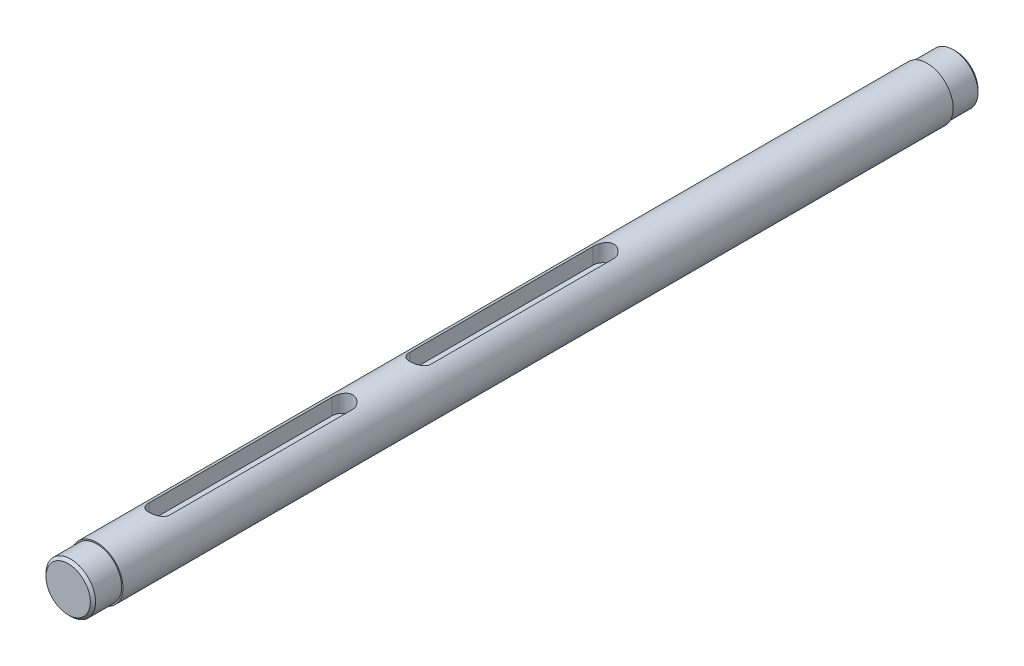
ISO-10303-21;
HEADER;
FILE_DESCRIPTION(('STEP AP214'),'2;1');
FILE_NAME('part.step','',(''),(''),'','','');
FILE_SCHEMA(('AUTOMOTIVE_DESIGN { 1 0 10303 214 1 1 1 1 }'));
ENDSEC;
DATA;
#1=APPLICATION_CONTEXT('core data for automotive mechanical design processes');
#2=APPLICATION_PROTOCOL_DEFINITION('international standard','automotive_design',2000,#1);
#3=PRODUCT_CONTEXT('',#1,'mechanical');
#4=PRODUCT('Part','Part','',(#3));
#5=PRODUCT_RELATED_PRODUCT_CATEGORY('part','',(#4));
#6=PRODUCT_DEFINITION_FORMATION('','',#4);
#7=PRODUCT_DEFINITION_CONTEXT('part definition',#1,'design');
#8=PRODUCT_DEFINITION('design','',#6,#7);
#9=PRODUCT_DEFINITION_SHAPE('','',#8);
#10=(LENGTH_UNIT() NAMED_UNIT(*) SI_UNIT(.MILLI.,.METRE.));
#11=(NAMED_UNIT(*) PLANE_ANGLE_UNIT() SI_UNIT($,.RADIAN.));
#12=(NAMED_UNIT(*) SI_UNIT($,.STERADIAN.) SOLID_ANGLE_UNIT());
#13=UNCERTAINTY_MEASURE_WITH_UNIT(LENGTH_MEASURE(1.E-05),#10,'distance_accuracy_value','');
#14=(GEOMETRIC_REPRESENTATION_CONTEXT(3) GLOBAL_UNCERTAINTY_ASSIGNED_CONTEXT((#13)) GLOBAL_UNIT_ASSIGNED_CONTEXT((#10,
#11,#12)) REPRESENTATION_CONTEXT('',''));
#15=CARTESIAN_POINT('',(0.,0.,0.));
#16=DIRECTION('',(0.,0.,1.));
#17=DIRECTION('',(1.,0.,0.));
#18=AXIS2_PLACEMENT_3D('',#15,#16,#17);
#19=CARTESIAN_POINT('',(0.,0.,170.));
#20=DIRECTION('',(0.,0.,-1.));
#21=DIRECTION('',(-1.,0.,0.));
#22=AXIS2_PLACEMENT_3D('',#19,#20,#21);
#23=CYLINDRICAL_SURFACE('',#22,5.);
#24=CARTESIAN_POINT('',(0.,0.,164.5));
#25=DIRECTION('',(0.,0.,1.));
#26=DIRECTION('',(1.,0.,0.));
#27=AXIS2_PLACEMENT_3D('',#24,#25,#26);
#28=CIRCLE('',#27,5.);
#29=CARTESIAN_POINT('',(5.,0.,164.5));
#30=VERTEX_POINT('',#29);
#31=EDGE_CURVE('E151',#30,#30,#28,.T.);
#32=ORIENTED_EDGE('',*,*,#31,.F.);
#33=EDGE_LOOP('',(#32));
#34=FACE_BOUND('',#33,.T.);
#35=CARTESIAN_POINT('',(0.,0.,5.5));
#36=DIRECTION('',(0.,0.,-1.));
#37=DIRECTION('',(-1.,0.,0.));
#38=AXIS2_PLACEMENT_3D('',#35,#36,#37);
#39=CIRCLE('',#38,5.);
#40=CARTESIAN_POINT('',(-5.,0.,5.5));
#41=VERTEX_POINT('',#40);
#42=EDGE_CURVE('E145',#41,#41,#39,.T.);
#43=ORIENTED_EDGE('',*,*,#42,.F.);
#44=EDGE_LOOP('',(#43));
#45=FACE_BOUND('',#44,.T.);
#46=CARTESIAN_POINT('',(0.,5.,119.5));
#47=CARTESIAN_POINT('',(0.107493005442879,4.99999271227085,119.499990148176));
#48=CARTESIAN_POINT('',(0.215172564090662,4.99649294306933,119.491282247912));
#49=CARTESIAN_POINT('',(0.427496480417884,4.98283453100642,119.456752296479));
#50=CARTESIAN_POINT('',(0.532131777561236,4.97265778698877,119.430883720914));
#51=CARTESIAN_POINT('',(0.734953922727389,4.94674209213119,119.363123921941));
#52=CARTESIAN_POINT('',(0.833160661616945,4.93102136364072,119.321285153783));
#53=CARTESIAN_POINT('',(1.02107197032835,4.89556610796078,119.222980826673));
#54=CARTESIAN_POINT('',(1.11077947675098,4.87583297458057,119.166520345081));
#55=CARTESIAN_POINT('',(1.28350100757038,4.83330886170419,119.037764501439));
#56=CARTESIAN_POINT('',(1.3660622725502,4.81042296929191,118.96489334376));
#57=CARTESIAN_POINT('',(1.51817500478471,4.76460576906195,118.806599996523));
#58=CARTESIAN_POINT('',(1.58772010713352,4.74167444453793,118.721171702788));
#59=CARTESIAN_POINT('',(1.71487456729287,4.69722791797137,118.535571929758));
#60=CARTESIAN_POINT('',(1.77181498119547,4.67582115964952,118.434913513977));
#61=CARTESIAN_POINT('',(1.86775471903714,4.63833647186793,118.22446360158));
#62=CARTESIAN_POINT('',(1.90676256428583,4.62225601244176,118.114676472152));
#63=CARTESIAN_POINT('',(1.96389882339586,4.59826357660819,117.894287666408));
#64=CARTESIAN_POINT('',(1.98289396580564,4.59001420355605,117.783948764424));
#65=CARTESIAN_POINT('',(2.00217296164002,4.58164004049144,117.561365001693));
#66=CARTESIAN_POINT('',(2.00246601631321,4.58151125522769,117.449121105375));
#67=CARTESIAN_POINT('',(1.98498936750453,4.58910500279995,117.234243328542));
#68=CARTESIAN_POINT('',(1.96847531430512,4.59628175038451,117.131484285591));
#69=CARTESIAN_POINT('',(1.91994688029781,4.61676187607837,116.930340443993));
#70=CARTESIAN_POINT('',(1.88792979480462,4.63006632321673,116.83195641189));
#71=CARTESIAN_POINT('',(1.80869473255106,4.66159485088531,116.639982163804));
#72=CARTESIAN_POINT('',(1.76117986231531,4.67991379280788,116.546530760945));
#73=CARTESIAN_POINT('',(1.65250646073221,4.7193811638989,116.368584183638));
#74=CARTESIAN_POINT('',(1.59134280510084,4.74053065456849,116.284092390597));
#75=CARTESIAN_POINT('',(1.45155059945443,4.78526736742271,116.119590271198));
#76=CARTESIAN_POINT('',(1.37193746297063,4.80891664976152,116.040431270554));
#77=CARTESIAN_POINT('',(1.20031442743018,4.85459824958282,115.896315521998));
#78=CARTESIAN_POINT('',(1.10830206533442,4.87663024445325,115.83136160259));
#79=CARTESIAN_POINT('',(0.912077652605827,4.91714681264549,115.716382552584));
#80=CARTESIAN_POINT('',(0.807660491346464,4.93555270095415,115.666677718803));
#81=CARTESIAN_POINT('',(0.591023765482872,4.96614828328759,115.585832138922));
#82=CARTESIAN_POINT('',(0.478808196849664,4.97834113462382,115.554681962443));
#83=CARTESIAN_POINT('',(0.256895887607812,4.99456139506911,115.51355170458));
#84=CARTESIAN_POINT('',(0.147443293985527,4.99902945833514,115.502427545746));
#85=CARTESIAN_POINT('',(-0.0718453098078256,5.00068478510631,115.498286899471));
#86=CARTESIAN_POINT('',(-0.181681213223933,4.99787393582292,115.505265718453));
#87=CARTESIAN_POINT('',(-0.393432739121997,4.98557567063753,115.536291752552));
#88=CARTESIAN_POINT('',(-0.495482491775483,4.97639391345523,115.559557980351));
#89=CARTESIAN_POINT('',(-0.69413542806079,4.952594414055,115.62143570831));
#90=CARTESIAN_POINT('',(-0.790737910224855,4.9379759735653,115.660049179669));
#91=CARTESIAN_POINT('',(-0.979078785816716,4.90416594770811,115.75278493968));
#92=CARTESIAN_POINT('',(-1.07057802275542,4.88484815979803,115.807345472043));
#93=CARTESIAN_POINT('',(-1.24344359124657,4.84373364745524,115.929940323906));
#94=CARTESIAN_POINT('',(-1.32480584076114,4.8219359311027,115.997980042923));
#95=CARTESIAN_POINT('',(-1.48072304302883,4.77645117638111,116.15087001295));
#96=CARTESIAN_POINT('',(-1.55447393380608,4.75273441425051,116.236533541506));
#97=CARTESIAN_POINT('',(-1.68675119741372,4.70741672917132,116.419440083009));
#98=CARTESIAN_POINT('',(-1.74527506133752,4.6858161552651,116.51668500034));
#99=CARTESIAN_POINT('',(-1.84580750193164,4.64714299907708,116.721461694594));
#100=CARTESIAN_POINT('',(-1.88765059453446,4.63011630884787,116.829083999212));
#101=CARTESIAN_POINT('',(-1.95229621970532,4.60323673477931,117.050733651715));
#102=CARTESIAN_POINT('',(-1.97511280526933,4.59337855695998,117.164756205812));
#103=CARTESIAN_POINT('',(-1.99971561727841,4.58271759299926,117.387127901775));
#104=CARTESIAN_POINT('',(-2.00289708230288,4.58131421008171,117.495294839593));
#105=CARTESIAN_POINT('',(-1.99180315927754,4.58614836033097,117.710544857713));
#106=CARTESIAN_POINT('',(-1.9775299879138,4.59238492324793,117.817628073903));
#107=CARTESIAN_POINT('',(-1.93307136615366,4.6112664907902,118.023332189855));
#108=CARTESIAN_POINT('',(-1.90353749357099,4.62364831827449,118.122120274433));
#109=CARTESIAN_POINT('',(-1.83000544849103,4.65324001232696,118.313378629613));
#110=CARTESIAN_POINT('',(-1.78600328139383,4.67045121206006,118.4058471469));
#111=CARTESIAN_POINT('',(-1.68187276275975,4.70898609604491,118.587609619271));
#112=CARTESIAN_POINT('',(-1.62096533515951,4.73048882313241,118.676418670131));
#113=CARTESIAN_POINT('',(-1.48589211927152,4.77463804372236,118.842993317204));
#114=CARTESIAN_POINT('',(-1.41172233481814,4.79728488048406,118.920755572128));
#115=CARTESIAN_POINT('',(-1.24650550627248,4.84293567087393,119.068202853264));
#116=CARTESIAN_POINT('',(-1.15467600114616,4.86586757962185,119.137037306898));
#117=CARTESIAN_POINT('',(-0.9599003202858,4.90800406713716,119.258337042622));
#118=CARTESIAN_POINT('',(-0.85694900454726,4.92720691092906,119.310794712153));
#119=CARTESIAN_POINT('',(-0.644738062495223,4.95939714815861,119.39662221519));
#120=CARTESIAN_POINT('',(-0.535631618219712,4.97249363055028,119.43032932356));
#121=CARTESIAN_POINT('',(-0.312876546281233,4.99144306209366,119.478639120954));
#122=CARTESIAN_POINT('',(-0.199243525858925,4.99731899495638,119.493302436744));
#123=CARTESIAN_POINT('',(-0.0569122978909417,4.99975899504136,119.499395380978));
#124=CARTESIAN_POINT('',(-0.0284626887407705,5.00000192969176,119.500002608629));
#125=CARTESIAN_POINT('',(0.,5.,119.5));
#126=B_SPLINE_CURVE_WITH_KNOTS('',3,(#46,#47,#48,#49,#50,#51,#52,#53,#54,#55,#56,#57,#58,#59,
#60,#61,#62,#63,#64,#65,#66,#67,#68,#69,#70,#71,#72,#73,#74,#75,#76,#77,#78,#79,#80,#81,#82,#83,
#84,#85,#86,#87,#88,#89,#90,#91,#92,#93,#94,#95,#96,#97,#98,#99,#100,#101,#102,#103,#104,#105,
#106,#107,#108,#109,#110,#111,#112,#113,#114,#115,#116,#117,#118,#119,#120,#121,#122,#123,#124,
#125),.UNSPECIFIED.,.T.,.F.,(4,2,2,2,2,2,2,2,2,2,2,2,2,2,2,2,2,2,2,2,2,2,2,2,2,2,2,2,2,2,2,2,2,
2,2,2,2,2,2,4),(0.,0.322402987893071,0.645683636007934,0.967911457471582,1.29002753567984,
1.62597381700398,1.96208394934411,2.31315258819219,2.66405423118269,2.99904105308829,
3.33386306340489,3.64538328401373,3.95695787256047,4.27489126298815,4.59294421938182,
4.93558349186556,5.27829092839733,5.62776913162806,5.9770695611379,6.30569184528007,
6.63422893570082,6.94800455564365,7.26182048993796,7.58523513398263,7.90877959498969,
8.25368474624413,8.59864669043747,8.94695045140826,9.29499672645934,9.61799673392749,
9.94095572563045,10.2511431854877,10.5614163580516,10.8894546805669,11.2175920134839,
11.5670042353384,11.9165786364053,12.2596430101332,12.6016125240434,12.686980458968),.UNSPECIFIED.);
#127=CARTESIAN_POINT('',(1.99999999999999,4.58257569495585,117.5));
#128=VERTEX_POINT('',#127);
#129=CARTESIAN_POINT('',(-2.00000000000001,4.58257569495583,117.5));
#130=VERTEX_POINT('',#129);
#131=EDGE_CURVE('E172',#128,#130,#126,.T.);
#132=ORIENTED_EDGE('',*,*,#131,.F.);
#133=DIRECTION('',(0.,0.,-1.));
#134=VECTOR('',#133,1.);
#135=CARTESIAN_POINT('',(1.99999999999998,4.58257569495585,170.));
#136=LINE('',#135,#134);
#137=CARTESIAN_POINT('',(1.99999999999998,4.58257569495585,152.5));
#138=VERTEX_POINT('',#137);
#139=EDGE_CURVE('E242',#138,#128,#136,.T.);
#140=ORIENTED_EDGE('',*,*,#139,.F.);
#141=CARTESIAN_POINT('',(0.,5.,154.5));
#142=CARTESIAN_POINT('',(0.107493005442876,4.99999271227085,154.499990148176));
#143=CARTESIAN_POINT('',(0.215172564090659,4.99649294306933,154.491282247912));
#144=CARTESIAN_POINT('',(0.427496480417881,4.98283453100642,154.456752296479));
#145=CARTESIAN_POINT('',(0.532131777561231,4.97265778698877,154.430883720914));
#146=CARTESIAN_POINT('',(0.734953922727388,4.94674209213119,154.363123921941));
#147=CARTESIAN_POINT('',(0.833160661616947,4.93102136364072,154.321285153783));
#148=CARTESIAN_POINT('',(1.02107197032835,4.89556610796078,154.222980826673));
#149=CARTESIAN_POINT('',(1.11077947675097,4.87583297458057,154.166520345081));
#150=CARTESIAN_POINT('',(1.28350100757037,4.83330886170419,154.037764501439));
#151=CARTESIAN_POINT('',(1.36606227255019,4.81042296929191,153.96489334376));
#152=CARTESIAN_POINT('',(1.5181750047847,4.76460576906195,153.806599996523));
#153=CARTESIAN_POINT('',(1.58772010713352,4.74167444453793,153.721171702788));
#154=CARTESIAN_POINT('',(1.71487456729286,4.69722791797137,153.535571929758));
#155=CARTESIAN_POINT('',(1.77181498119545,4.67582115964952,153.434913513977));
#156=CARTESIAN_POINT('',(1.86775471903713,4.63833647186793,153.22446360158));
#157=CARTESIAN_POINT('',(1.90676256428582,4.62225601244176,153.114676472152));
#158=CARTESIAN_POINT('',(1.96389882339585,4.59826357660819,152.894287666408));
#159=CARTESIAN_POINT('',(1.98289396580563,4.59001420355606,152.783948764424));
#160=CARTESIAN_POINT('',(2.00217296164001,4.58164004049145,152.561365001693));
#161=CARTESIAN_POINT('',(2.00246601631321,4.58151125522769,152.449121105375));
#162=CARTESIAN_POINT('',(1.98498936750453,4.58910500279995,152.234243328542));
#163=CARTESIAN_POINT('',(1.96847531430512,4.59628175038451,152.131484285591));
#164=CARTESIAN_POINT('',(1.91994688029781,4.61676187607836,151.930340443993));
#165=CARTESIAN_POINT('',(1.88792979480462,4.63006632321673,151.83195641189));
#166=CARTESIAN_POINT('',(1.80869473255106,4.66159485088531,151.639982163804));
#167=CARTESIAN_POINT('',(1.76117986231531,4.67991379280788,151.546530760945));
#168=CARTESIAN_POINT('',(1.6525064607322,4.7193811638989,151.368584183638));
#169=CARTESIAN_POINT('',(1.59134280510083,4.74053065456849,151.284092390597));
#170=CARTESIAN_POINT('',(1.45155059945442,4.78526736742271,151.119590271198));
#171=CARTESIAN_POINT('',(1.37193746297063,4.80891664976152,151.040431270554));
#172=CARTESIAN_POINT('',(1.20031442743019,4.85459824958282,150.896315521998));
#173=CARTESIAN_POINT('',(1.10830206533443,4.87663024445325,150.83136160259));
#174=CARTESIAN_POINT('',(0.91207765260583,4.91714681264549,150.716382552584));
#175=CARTESIAN_POINT('',(0.807660491346466,4.93555270095415,150.666677718803));
#176=CARTESIAN_POINT('',(0.591023765482872,4.96614828328759,150.585832138922));
#177=CARTESIAN_POINT('',(0.478808196849663,4.97834113462382,150.554681962443));
#178=CARTESIAN_POINT('',(0.256895887607808,4.99456139506911,150.51355170458));
#179=CARTESIAN_POINT('',(0.147443293985522,4.99902945833514,150.502427545746));
#180=CARTESIAN_POINT('',(-0.0718453098078283,5.00068478510631,150.498286899471));
#181=CARTESIAN_POINT('',(-0.181681213223934,4.99787393582292,150.505265718453));
#182=CARTESIAN_POINT('',(-0.393432739121999,4.98557567063753,150.536291752552));
#183=CARTESIAN_POINT('',(-0.495482491775487,4.97639391345523,150.559557980351));
#184=CARTESIAN_POINT('',(-0.694135428060793,4.952594414055,150.62143570831));
#185=CARTESIAN_POINT('',(-0.790737910224856,4.9379759735653,150.660049179669));
#186=CARTESIAN_POINT('',(-0.979078785816715,4.90416594770811,150.75278493968));
#187=CARTESIAN_POINT('',(-1.07057802275542,4.88484815979803,150.807345472043));
#188=CARTESIAN_POINT('',(-1.24344359124657,4.84373364745524,150.929940323906));
#189=CARTESIAN_POINT('',(-1.32480584076114,4.8219359311027,150.997980042923));
#190=CARTESIAN_POINT('',(-1.48072304302883,4.77645117638111,151.15087001295));
#191=CARTESIAN_POINT('',(-1.55447393380608,4.75273441425052,151.236533541506));
#192=CARTESIAN_POINT('',(-1.68675119741373,4.70741672917132,151.419440083009));
#193=CARTESIAN_POINT('',(-1.74527506133753,4.6858161552651,151.51668500034));
#194=CARTESIAN_POINT('',(-1.84580750193165,4.64714299907708,151.721461694594));
#195=CARTESIAN_POINT('',(-1.88765059453447,4.63011630884787,151.829083999212));
#196=CARTESIAN_POINT('',(-1.95229621970532,4.60323673477931,152.050733651715));
#197=CARTESIAN_POINT('',(-1.97511280526933,4.59337855695998,152.164756205812));
#198=CARTESIAN_POINT('',(-1.99971561727842,4.58271759299926,152.387127901775));
#199=CARTESIAN_POINT('',(-2.00289708230288,4.58131421008171,152.495294839593));
#200=CARTESIAN_POINT('',(-1.99180315927754,4.58614836033097,152.710544857713));
#201=CARTESIAN_POINT('',(-1.9775299879138,4.59238492324793,152.817628073903));
#202=CARTESIAN_POINT('',(-1.93307136615367,4.6112664907902,153.023332189855));
#203=CARTESIAN_POINT('',(-1.90353749357099,4.62364831827449,153.122120274433));
#204=CARTESIAN_POINT('',(-1.83000544849103,4.65324001232696,153.313378629614));
#205=CARTESIAN_POINT('',(-1.78600328139384,4.67045121206006,153.4058471469));
#206=CARTESIAN_POINT('',(-1.68187276275976,4.7089860960449,153.587609619271));
#207=CARTESIAN_POINT('',(-1.62096533515952,4.73048882313241,153.67641867013));
#208=CARTESIAN_POINT('',(-1.48589211927153,4.77463804372236,153.842993317204));
#209=CARTESIAN_POINT('',(-1.41172233481815,4.79728488048406,153.920755572128));
#210=CARTESIAN_POINT('',(-1.24650550627249,4.84293567087393,154.068202853264));
#211=CARTESIAN_POINT('',(-1.15467600114616,4.86586757962185,154.137037306898));
#212=CARTESIAN_POINT('',(-0.959900320285798,4.90800406713716,154.258337042622));
#213=CARTESIAN_POINT('',(-0.85694900454726,4.92720691092906,154.310794712153));
#214=CARTESIAN_POINT('',(-0.644738062495229,4.95939714815861,154.39662221519));
#215=CARTESIAN_POINT('',(-0.535631618219721,4.97249363055028,154.43032932356));
#216=CARTESIAN_POINT('',(-0.31287654628125,4.99144306209366,154.478639120954));
#217=CARTESIAN_POINT('',(-0.199243525858946,4.99731899495637,154.493302436744));
#218=CARTESIAN_POINT('',(-0.0569122978909597,4.99975899504136,154.499395380978));
#219=CARTESIAN_POINT('',(-0.0284626887407817,5.00000192969176,154.500002608629));
#220=CARTESIAN_POINT('',(0.,5.,154.5));
#221=B_SPLINE_CURVE_WITH_KNOTS('',3,(#141,#142,#143,#144,#145,#146,#147,#148,#149,#150,#151,
#152,#153,#154,#155,#156,#157,#158,#159,#160,#161,#162,#163,#164,#165,#166,#167,#168,#169,#170,
#171,#172,#173,#174,#175,#176,#177,#178,#179,#180,#181,#182,#183,#184,#185,#186,#187,#188,#189,
#190,#191,#192,#193,#194,#195,#196,#197,#198,#199,#200,#201,#202,#203,#204,#205,#206,#207,#208,
#209,#210,#211,#212,#213,#214,#215,#216,#217,#218,#219,#220),.UNSPECIFIED.,.T.,.F.,(4,2,2,2,2,2,
2,2,2,2,2,2,2,2,2,2,2,2,2,2,2,2,2,2,2,2,2,2,2,2,2,2,2,2,2,2,2,2,2,4),(0.,0.322402987893073,
0.645683636007933,0.96791145747159,1.29002753567984,1.62597381700398,1.9620839493441,
2.31315258819216,2.66405423118269,2.99904105308828,3.33386306340484,3.6453832840137,
3.95695787256047,4.27489126298814,4.59294421938182,4.93558349186555,5.27829092839733,
5.62776913162805,5.9770695611379,6.30569184528007,6.63422893570081,6.94800455564365,
7.26182048993795,7.58523513398263,7.90877959498968,8.25368474624411,8.59864669043747,
8.94695045140829,9.29499672645935,9.61799673392748,9.94095572563046,10.2511431854877,
10.5614163580516,10.8894546805669,11.2175920134839,11.5670042353384,11.9165786364053,
12.2596430101332,12.6016125240434,12.686980458968),.UNSPECIFIED.);
#222=CARTESIAN_POINT('',(-2.00000000000002,4.58257569495583,152.5));
#223=VERTEX_POINT('',#222);
#224=EDGE_CURVE('E166',#223,#138,#221,.T.);
#225=ORIENTED_EDGE('',*,*,#224,.F.);
#226=DIRECTION('',(0.,0.,-1.));
#227=VECTOR('',#226,1.);
#228=CARTESIAN_POINT('',(-2.00000000000002,4.58257569495583,170.));
#229=LINE('',#228,#227);
#230=EDGE_CURVE('E283',#130,#223,#229,.F.);
#231=ORIENTED_EDGE('',*,*,#230,.F.);
#232=EDGE_LOOP('',(#132,#140,#225,#231));
#233=FACE_BOUND('',#232,.T.);
#234=CARTESIAN_POINT('',(0.,5.,69.5));
#235=CARTESIAN_POINT('',(0.107493005442892,4.99999271227085,69.4999901481763));
#236=CARTESIAN_POINT('',(0.215172564090673,4.99649294306932,69.4912822479116));
#237=CARTESIAN_POINT('',(0.427496480417895,4.98283453100641,69.4567522964788));
#238=CARTESIAN_POINT('',(0.532131777561248,4.97265778698877,69.4308837209139));
#239=CARTESIAN_POINT('',(0.734953922727402,4.94674209213118,69.3631239219412));
#240=CARTESIAN_POINT('',(0.833160661616957,4.93102136364072,69.3212851537833));
#241=CARTESIAN_POINT('',(1.02107197032836,4.89556610796078,69.2229808266734));
#242=CARTESIAN_POINT('',(1.11077947675099,4.87583297458057,69.1665203450811));
#243=CARTESIAN_POINT('',(1.28350100757039,4.83330886170419,69.0377645014391));
#244=CARTESIAN_POINT('',(1.36606227255021,4.81042296929191,68.9648933437597));
#245=CARTESIAN_POINT('',(1.51817500478472,4.76460576906195,68.8065999965232));
#246=CARTESIAN_POINT('',(1.58772010713353,4.74167444453792,68.7211717027883));
#247=CARTESIAN_POINT('',(1.71487456729288,4.69722791797136,68.5355719297577));
#248=CARTESIAN_POINT('',(1.77181498119548,4.67582115964951,68.4349135139768));
#249=CARTESIAN_POINT('',(1.86775471903715,4.63833647186792,68.22446360158));
#250=CARTESIAN_POINT('',(1.90676256428584,4.62225601244176,68.1146764721516));
#251=CARTESIAN_POINT('',(1.96389882339587,4.59826357660818,67.8942876664079));
#252=CARTESIAN_POINT('',(1.98289396580565,4.59001420355605,67.7839487644238));
#253=CARTESIAN_POINT('',(2.00217296164003,4.58164004049144,67.5613650016927));
#254=CARTESIAN_POINT('',(2.00246601631322,4.58151125522768,67.449121105375));
#255=CARTESIAN_POINT('',(1.98498936750454,4.58910500279994,67.234243328542));
#256=CARTESIAN_POINT('',(1.96847531430514,4.5962817503845,67.131484285591));
#257=CARTESIAN_POINT('',(1.91994688029782,4.61676187607836,66.9303404439933));
#258=CARTESIAN_POINT('',(1.88792979480463,4.63006632321673,66.8319564118897));
#259=CARTESIAN_POINT('',(1.80869473255107,4.6615948508853,66.639982163804));
#260=CARTESIAN_POINT('',(1.76117986231532,4.67991379280787,66.5465307609453));
#261=CARTESIAN_POINT('',(1.65250646073222,4.7193811638989,66.3685841836384));
#262=CARTESIAN_POINT('',(1.59134280510085,4.74053065456848,66.2840923905972));
#263=CARTESIAN_POINT('',(1.45155059945444,4.78526736742271,66.119590271198));
#264=CARTESIAN_POINT('',(1.37193746297064,4.80891664976151,66.040431270554));
#265=CARTESIAN_POINT('',(1.20031442743019,4.85459824958282,65.896315521998));
#266=CARTESIAN_POINT('',(1.10830206533443,4.87663024445325,65.8313616025897));
#267=CARTESIAN_POINT('',(0.912077652605839,4.91714681264549,65.7163825525842));
#268=CARTESIAN_POINT('',(0.807660491346475,4.93555270095415,65.6666777188029));
#269=CARTESIAN_POINT('',(0.591023765482883,4.96614828328759,65.5858321389219));
#270=CARTESIAN_POINT('',(0.478808196849676,4.97834113462382,65.5546819624426));
#271=CARTESIAN_POINT('',(0.256895887607823,4.99456139506911,65.5135517045803));
#272=CARTESIAN_POINT('',(0.147443293985538,4.99902945833514,65.5024275457465));
#273=CARTESIAN_POINT('',(-0.0718453098078139,5.00068478510631,65.4982868994714));
#274=CARTESIAN_POINT('',(-0.181681213223921,4.99787393582291,65.5052657184525));
#275=CARTESIAN_POINT('',(-0.393432739121984,4.98557567063753,65.536291752552));
#276=CARTESIAN_POINT('',(-0.49548249177547,4.97639391345523,65.559557980351));
#277=CARTESIAN_POINT('',(-0.694135428060776,4.952594414055,65.6214357083098));
#278=CARTESIAN_POINT('',(-0.790737910224841,4.9379759735653,65.6600491796687));
#279=CARTESIAN_POINT('',(-0.9790787858167,4.90416594770812,65.75278493968));
#280=CARTESIAN_POINT('',(-1.0705780227554,4.88484815979804,65.8073454720431));
#281=CARTESIAN_POINT('',(-1.24344359124655,4.84373364745525,65.9299403239056));
#282=CARTESIAN_POINT('',(-1.32480584076112,4.8219359311027,65.9979800429226));
#283=CARTESIAN_POINT('',(-1.48072304302882,4.77645117638112,66.1508700129496));
#284=CARTESIAN_POINT('',(-1.55447393380606,4.75273441425052,66.2365335415062));
#285=CARTESIAN_POINT('',(-1.68675119741371,4.70741672917132,66.4194400830094));
#286=CARTESIAN_POINT('',(-1.74527506133751,4.68581615526511,66.5166850003399));
#287=CARTESIAN_POINT('',(-1.84580750193162,4.64714299907709,66.7214616945941));
#288=CARTESIAN_POINT('',(-1.88765059453445,4.63011630884788,66.8290839992123));
#289=CARTESIAN_POINT('',(-1.9522962197053,4.60323673477931,67.0507336517151));
#290=CARTESIAN_POINT('',(-1.97511280526931,4.59337855695998,67.1647562058124));
#291=CARTESIAN_POINT('',(-1.9997156172784,4.58271759299926,67.3871279017745));
#292=CARTESIAN_POINT('',(-2.00289708230287,4.58131421008171,67.4952948395934));
#293=CARTESIAN_POINT('',(-1.99180315927752,4.58614836033098,67.7105448577133));
#294=CARTESIAN_POINT('',(-1.97752998791378,4.59238492324794,67.8176280739026));
#295=CARTESIAN_POINT('',(-1.93307136615365,4.61126649079021,68.023332189855));
#296=CARTESIAN_POINT('',(-1.90353749357098,4.62364831827449,68.122120274433));
#297=CARTESIAN_POINT('',(-1.83000544849101,4.65324001232696,68.3133786296135));
#298=CARTESIAN_POINT('',(-1.78600328139382,4.67045121206007,68.4058471468998));
#299=CARTESIAN_POINT('',(-1.68187276275974,4.70898609604491,68.5876096192708));
#300=CARTESIAN_POINT('',(-1.6209653351595,4.73048882313242,68.6764186701305));
#301=CARTESIAN_POINT('',(-1.4858921192715,4.77463804372237,68.8429933172037));
#302=CARTESIAN_POINT('',(-1.41172233481813,4.79728488048406,68.9207555721283));
#303=CARTESIAN_POINT('',(-1.24650550627247,4.84293567087394,69.0682028532636));
#304=CARTESIAN_POINT('',(-1.15467600114615,4.86586757962185,69.1370373068981));
#305=CARTESIAN_POINT('',(-0.959900320285787,4.90800406713717,69.2583370426216));
#306=CARTESIAN_POINT('',(-0.856949004547246,4.92720691092906,69.3107947121525));
#307=CARTESIAN_POINT('',(-0.644738062495211,4.95939714815861,69.3966222151903));
#308=CARTESIAN_POINT('',(-0.535631618219703,4.97249363055028,69.4303293235603));
#309=CARTESIAN_POINT('',(-0.312876546281226,4.99144306209366,69.4786391209543));
#310=CARTESIAN_POINT('',(-0.199243525858918,4.99731899495638,69.4933024367439));
#311=CARTESIAN_POINT('',(-0.0569122978909324,4.99975899504136,69.4993953809783));
#312=CARTESIAN_POINT('',(-0.0284626887407597,5.00000192969176,69.5000026086292));
#313=CARTESIAN_POINT('',(0.,5.,69.5));
#314=B_SPLINE_CURVE_WITH_KNOTS('',3,(#234,#235,#236,#237,#238,#239,#240,#241,#242,#243,#244,
#245,#246,#247,#248,#249,#250,#251,#252,#253,#254,#255,#256,#257,#258,#259,#260,#261,#262,#263,
#264,#265,#266,#267,#268,#269,#270,#271,#272,#273,#274,#275,#276,#277,#278,#279,#280,#281,#282,
#283,#284,#285,#286,#287,#288,#289,#290,#291,#292,#293,#294,#295,#296,#297,#298,#299,#300,#301,
#302,#303,#304,#305,#306,#307,#308,#309,#310,#311,#312,#313),.UNSPECIFIED.,.T.,.F.,(4,2,2,2,2,2,
2,2,2,2,2,2,2,2,2,2,2,2,2,2,2,2,2,2,2,2,2,2,2,2,2,2,2,2,2,2,2,2,2,4),(0.,0.322402987893072,
0.645683636007931,0.96791145747158,1.29002753567984,1.62597381700397,1.96208394934411,
2.31315258819218,2.66405423118269,2.99904105308829,3.33386306340489,3.64538328401373,
3.95695787256046,4.27489126298815,4.59294421938182,4.93558349186556,5.27829092839733,
5.62776913162806,5.9770695611379,6.30569184528006,6.63422893570081,6.94800455564365,
7.26182048993795,7.58523513398261,7.90877959498969,8.25368474624412,8.59864669043747,
8.94695045140825,9.29499672645933,9.61799673392748,9.94095572563044,10.2511431854877,
10.5614163580516,10.8894546805669,11.2175920134839,11.5670042353383,11.9165786364053,
12.2596430101332,12.6016125240434,12.686980458968),.UNSPECIFIED.);
#315=CARTESIAN_POINT('',(2.,4.58257569495584,67.5));
#316=VERTEX_POINT('',#315);
#317=CARTESIAN_POINT('',(-2.,4.58257569495584,67.5));
#318=VERTEX_POINT('',#317);
#319=EDGE_CURVE('E239',#316,#318,#314,.T.);
#320=ORIENTED_EDGE('',*,*,#319,.F.);
#321=DIRECTION('',(0.,0.,-1.));
#322=VECTOR('',#321,1.);
#323=CARTESIAN_POINT('',(2.,4.58257569495584,170.));
#324=LINE('',#323,#322);
#325=CARTESIAN_POINT('',(2.,4.58257569495584,102.5));
#326=VERTEX_POINT('',#325);
#327=EDGE_CURVE('E11',#326,#316,#324,.T.);
#328=ORIENTED_EDGE('',*,*,#327,.F.);
#329=CARTESIAN_POINT('',(0.,5.,104.5));
#330=CARTESIAN_POINT('',(0.107493005442892,4.99999271227085,104.499990148176));
#331=CARTESIAN_POINT('',(0.215172564090673,4.99649294306932,104.491282247912));
#332=CARTESIAN_POINT('',(0.427496480417895,4.98283453100641,104.456752296479));
#333=CARTESIAN_POINT('',(0.532131777561248,4.97265778698877,104.430883720914));
#334=CARTESIAN_POINT('',(0.734953922727402,4.94674209213118,104.363123921941));
#335=CARTESIAN_POINT('',(0.833160661616957,4.93102136364072,104.321285153783));
#336=CARTESIAN_POINT('',(1.02107197032836,4.89556610796078,104.222980826673));
#337=CARTESIAN_POINT('',(1.11077947675099,4.87583297458057,104.166520345081));
#338=CARTESIAN_POINT('',(1.28350100757039,4.83330886170419,104.037764501439));
#339=CARTESIAN_POINT('',(1.36606227255021,4.81042296929191,103.96489334376));
#340=CARTESIAN_POINT('',(1.51817500478472,4.76460576906195,103.806599996523));
#341=CARTESIAN_POINT('',(1.58772010713353,4.74167444453792,103.721171702788));
#342=CARTESIAN_POINT('',(1.71487456729288,4.69722791797136,103.535571929758));
#343=CARTESIAN_POINT('',(1.77181498119548,4.67582115964951,103.434913513977));
#344=CARTESIAN_POINT('',(1.86775471903715,4.63833647186792,103.22446360158));
#345=CARTESIAN_POINT('',(1.90676256428584,4.62225601244176,103.114676472152));
#346=CARTESIAN_POINT('',(1.96389882339587,4.59826357660818,102.894287666408));
#347=CARTESIAN_POINT('',(1.98289396580565,4.59001420355605,102.783948764424));
#348=CARTESIAN_POINT('',(2.00217296164003,4.58164004049144,102.561365001693));
#349=CARTESIAN_POINT('',(2.00246601631322,4.58151125522768,102.449121105375));
#350=CARTESIAN_POINT('',(1.98498936750454,4.58910500279994,102.234243328542));
#351=CARTESIAN_POINT('',(1.96847531430514,4.5962817503845,102.131484285591));
#352=CARTESIAN_POINT('',(1.91994688029782,4.61676187607836,101.930340443993));
#353=CARTESIAN_POINT('',(1.88792979480463,4.63006632321673,101.83195641189));
#354=CARTESIAN_POINT('',(1.80869473255107,4.6615948508853,101.639982163804));
#355=CARTESIAN_POINT('',(1.76117986231532,4.67991379280787,101.546530760945));
#356=CARTESIAN_POINT('',(1.65250646073222,4.7193811638989,101.368584183638));
#357=CARTESIAN_POINT('',(1.59134280510085,4.74053065456848,101.284092390597));
#358=CARTESIAN_POINT('',(1.45155059945444,4.78526736742271,101.119590271198));
#359=CARTESIAN_POINT('',(1.37193746297064,4.80891664976151,101.040431270554));
#360=CARTESIAN_POINT('',(1.20031442743019,4.85459824958282,100.896315521998));
#361=CARTESIAN_POINT('',(1.10830206533443,4.87663024445325,100.83136160259));
#362=CARTESIAN_POINT('',(0.912077652605839,4.91714681264549,100.716382552584));
#363=CARTESIAN_POINT('',(0.807660491346475,4.93555270095415,100.666677718803));
#364=CARTESIAN_POINT('',(0.591023765482883,4.96614828328759,100.585832138922));
#365=CARTESIAN_POINT('',(0.478808196849676,4.97834113462382,100.554681962443));
#366=CARTESIAN_POINT('',(0.256895887607823,4.99456139506911,100.51355170458));
#367=CARTESIAN_POINT('',(0.147443293985538,4.99902945833514,100.502427545746));
#368=CARTESIAN_POINT('',(-0.0718453098078136,5.00068478510631,100.498286899471));
#369=CARTESIAN_POINT('',(-0.181681213223921,4.99787393582291,100.505265718452));
#370=CARTESIAN_POINT('',(-0.393432739121984,4.98557567063753,100.536291752552));
#371=CARTESIAN_POINT('',(-0.49548249177547,4.97639391345523,100.559557980351));
#372=CARTESIAN_POINT('',(-0.694135428060777,4.952594414055,100.62143570831));
#373=CARTESIAN_POINT('',(-0.790737910224842,4.9379759735653,100.660049179669));
#374=CARTESIAN_POINT('',(-0.979078785816703,4.90416594770812,100.75278493968));
#375=CARTESIAN_POINT('',(-1.07057802275541,4.88484815979804,100.807345472043));
#376=CARTESIAN_POINT('',(-1.24344359124656,4.84373364745525,100.929940323906));
#377=CARTESIAN_POINT('',(-1.32480584076112,4.8219359311027,100.997980042923));
#378=CARTESIAN_POINT('',(-1.48072304302882,4.77645117638112,101.15087001295));
#379=CARTESIAN_POINT('',(-1.55447393380607,4.75273441425052,101.236533541506));
#380=CARTESIAN_POINT('',(-1.68675119741371,4.70741672917132,101.419440083009));
#381=CARTESIAN_POINT('',(-1.74527506133751,4.68581615526511,101.51668500034));
#382=CARTESIAN_POINT('',(-1.84580750193162,4.64714299907709,101.721461694594));
#383=CARTESIAN_POINT('',(-1.88765059453445,4.63011630884788,101.829083999212));
#384=CARTESIAN_POINT('',(-1.9522962197053,4.60323673477931,102.050733651715));
#385=CARTESIAN_POINT('',(-1.97511280526931,4.59337855695998,102.164756205812));
#386=CARTESIAN_POINT('',(-1.9997156172784,4.58271759299926,102.387127901775));
#387=CARTESIAN_POINT('',(-2.00289708230287,4.58131421008171,102.495294839593));
#388=CARTESIAN_POINT('',(-1.99180315927752,4.58614836033098,102.710544857713));
#389=CARTESIAN_POINT('',(-1.97752998791378,4.59238492324794,102.817628073903));
#390=CARTESIAN_POINT('',(-1.93307136615365,4.61126649079021,103.023332189855));
#391=CARTESIAN_POINT('',(-1.90353749357098,4.62364831827449,103.122120274433));
#392=CARTESIAN_POINT('',(-1.83000544849101,4.65324001232696,103.313378629613));
#393=CARTESIAN_POINT('',(-1.78600328139382,4.67045121206007,103.4058471469));
#394=CARTESIAN_POINT('',(-1.68187276275974,4.70898609604491,103.587609619271));
#395=CARTESIAN_POINT('',(-1.6209653351595,4.73048882313242,103.67641867013));
#396=CARTESIAN_POINT('',(-1.4858921192715,4.77463804372237,103.842993317204));
#397=CARTESIAN_POINT('',(-1.41172233481813,4.79728488048406,103.920755572128));
#398=CARTESIAN_POINT('',(-1.24650550627247,4.84293567087394,104.068202853264));
#399=CARTESIAN_POINT('',(-1.15467600114615,4.86586757962185,104.137037306898));
#400=CARTESIAN_POINT('',(-0.959900320285787,4.90800406713717,104.258337042622));
#401=CARTESIAN_POINT('',(-0.856949004547246,4.92720691092906,104.310794712153));
#402=CARTESIAN_POINT('',(-0.64473806249521,4.95939714815861,104.39662221519));
#403=CARTESIAN_POINT('',(-0.535631618219701,4.97249363055028,104.43032932356));
#404=CARTESIAN_POINT('',(-0.312876546281224,4.99144306209366,104.478639120954));
#405=CARTESIAN_POINT('',(-0.199243525858917,4.99731899495638,104.493302436744));
#406=CARTESIAN_POINT('',(-0.0569122978909324,4.99975899504136,104.499395380978));
#407=CARTESIAN_POINT('',(-0.0284626887407597,5.00000192969176,104.500002608629));
#408=CARTESIAN_POINT('',(0.,5.,104.5));
#409=B_SPLINE_CURVE_WITH_KNOTS('',3,(#329,#330,#331,#332,#333,#334,#335,#336,#337,#338,#339,
#340,#341,#342,#343,#344,#345,#346,#347,#348,#349,#350,#351,#352,#353,#354,#355,#356,#357,#358,
#359,#360,#361,#362,#363,#364,#365,#366,#367,#368,#369,#370,#371,#372,#373,#374,#375,#376,#377,
#378,#379,#380,#381,#382,#383,#384,#385,#386,#387,#388,#389,#390,#391,#392,#393,#394,#395,#396,
#397,#398,#399,#400,#401,#402,#403,#404,#405,#406,#407,#408),.UNSPECIFIED.,.T.,.F.,(4,2,2,2,2,2,
2,2,2,2,2,2,2,2,2,2,2,2,2,2,2,2,2,2,2,2,2,2,2,2,2,2,2,2,2,2,2,2,2,4),(0.,0.322402987893072,
0.645683636007931,0.96791145747158,1.29002753567984,1.62597381700397,1.96208394934411,
2.31315258819218,2.66405423118269,2.99904105308829,3.33386306340489,3.64538328401373,
3.95695787256046,4.27489126298815,4.59294421938182,4.93558349186556,5.27829092839733,
5.62776913162806,5.9770695611379,6.30569184528006,6.63422893570081,6.94800455564365,
7.26182048993795,7.58523513398263,7.90877959498969,8.25368474624412,8.59864669043747,
8.94695045140825,9.29499672645933,9.61799673392748,9.94095572563044,10.2511431854877,
10.5614163580516,10.8894546805669,11.2175920134839,11.5670042353383,11.9165786364053,
12.2596430101332,12.6016125240434,12.686980458968),.UNSPECIFIED.);
#410=CARTESIAN_POINT('',(-2.,4.58257569495584,102.5));
#411=VERTEX_POINT('',#410);
#412=EDGE_CURVE('E41',#411,#326,#409,.T.);
#413=ORIENTED_EDGE('',*,*,#412,.F.);
#414=DIRECTION('',(0.,0.,-1.));
#415=VECTOR('',#414,1.);
#416=CARTESIAN_POINT('',(-2.,4.58257569495584,170.));
#417=LINE('',#416,#415);
#418=EDGE_CURVE('E116',#318,#411,#417,.F.);
#419=ORIENTED_EDGE('',*,*,#418,.F.);
#420=EDGE_LOOP('',(#320,#328,#413,#419));
#421=FACE_BOUND('',#420,.T.);
#422=ADVANCED_FACE('F33',(#34,#45,#233,#421),#23,.T.);
#423=CARTESIAN_POINT('',(0.,0.,164.5));
#424=DIRECTION('',(0.,0.,1.));
#425=DIRECTION('',(1.,0.,0.));
#426=AXIS2_PLACEMENT_3D('',#423,#424,#425);
#427=PLANE('',#426);
#428=CARTESIAN_POINT('',(0.,0.,164.5));
#429=DIRECTION('',(0.,0.,1.));
#430=DIRECTION('',(1.,0.,0.));
#431=AXIS2_PLACEMENT_3D('',#428,#429,#430);
#432=CIRCLE('',#431,4.75);
#433=CARTESIAN_POINT('',(4.75,0.,164.5));
#434=VERTEX_POINT('',#433);
#435=EDGE_CURVE('E148',#434,#434,#432,.T.);
#436=ORIENTED_EDGE('',*,*,#435,.F.);
#437=EDGE_LOOP('',(#436));
#438=FACE_BOUND('',#437,.T.);
#439=ORIENTED_EDGE('',*,*,#31,.T.);
#440=EDGE_LOOP('',(#439));
#441=FACE_BOUND('',#440,.T.);
#442=ADVANCED_FACE('F208',(#438,#441),#427,.T.);
#443=CARTESIAN_POINT('',(0.,0.,164.5));
#444=DIRECTION('',(0.,0.,1.));
#445=DIRECTION('',(1.,0.,0.));
#446=AXIS2_PLACEMENT_3D('',#443,#444,#445);
#447=CYLINDRICAL_SURFACE('',#446,4.75);
#448=CARTESIAN_POINT('',(0.,0.,169.5));
#449=DIRECTION('',(0.,0.,1.));
#450=DIRECTION('',(1.,0.,0.));
#451=AXIS2_PLACEMENT_3D('',#448,#449,#450);
#452=CIRCLE('',#451,4.75);
#453=CARTESIAN_POINT('',(4.75,0.,169.5));
#454=VERTEX_POINT('',#453);
#455=EDGE_CURVE('E157',#454,#454,#452,.F.);
#456=ORIENTED_EDGE('',*,*,#455,.T.);
#457=EDGE_LOOP('',(#456));
#458=FACE_BOUND('',#457,.T.);
#459=ORIENTED_EDGE('',*,*,#435,.T.);
#460=EDGE_LOOP('',(#459));
#461=FACE_BOUND('',#460,.T.);
#462=ADVANCED_FACE('F205',(#458,#461),#447,.T.);
#463=CARTESIAN_POINT('',(0.,0.,170.));
#464=DIRECTION('',(0.,0.,1.));
#465=DIRECTION('',(1.,0.,0.));
#466=AXIS2_PLACEMENT_3D('',#463,#464,#465);
#467=PLANE('',#466);
#468=CARTESIAN_POINT('',(0.,0.,170.));
#469=DIRECTION('',(0.,0.,1.));
#470=DIRECTION('',(1.,0.,0.));
#471=AXIS2_PLACEMENT_3D('',#468,#469,#470);
#472=CIRCLE('',#471,4.25);
#473=CARTESIAN_POINT('',(4.25,0.,170.));
#474=VERTEX_POINT('',#473);
#475=EDGE_CURVE('E154',#474,#474,#472,.T.);
#476=ORIENTED_EDGE('',*,*,#475,.T.);
#477=EDGE_LOOP('',(#476));
#478=FACE_BOUND('',#477,.T.);
#479=ADVANCED_FACE('F203',(#478),#467,.T.);
#480=CARTESIAN_POINT('',(0.,0.,5.5));
#481=DIRECTION('',(0.,0.,-1.));
#482=DIRECTION('',(-1.,0.,0.));
#483=AXIS2_PLACEMENT_3D('',#480,#481,#482);
#484=PLANE('',#483);
#485=CARTESIAN_POINT('',(0.,0.,5.5));
#486=DIRECTION('',(0.,0.,-1.));
#487=DIRECTION('',(-1.,0.,0.));
#488=AXIS2_PLACEMENT_3D('',#485,#486,#487);
#489=CIRCLE('',#488,4.75);
#490=CARTESIAN_POINT('',(-4.75,0.,5.5));
#491=VERTEX_POINT('',#490);
#492=EDGE_CURVE('E142',#491,#491,#489,.T.);
#493=ORIENTED_EDGE('',*,*,#492,.F.);
#494=EDGE_LOOP('',(#493));
#495=FACE_BOUND('',#494,.T.);
#496=ORIENTED_EDGE('',*,*,#42,.T.);
#497=EDGE_LOOP('',(#496));
#498=FACE_BOUND('',#497,.T.);
#499=ADVANCED_FACE('F199',(#495,#498),#484,.T.);
#500=CARTESIAN_POINT('',(0.,0.,5.5));
#501=DIRECTION('',(0.,0.,-1.));
#502=DIRECTION('',(-1.,0.,0.));
#503=AXIS2_PLACEMENT_3D('',#500,#501,#502);
#504=CYLINDRICAL_SURFACE('',#503,4.75);
#505=CARTESIAN_POINT('',(0.,0.,0.500000000000013));
#506=DIRECTION('',(0.,0.,1.));
#507=DIRECTION('',(1.,0.,0.));
#508=AXIS2_PLACEMENT_3D('',#505,#506,#507);
#509=CIRCLE('',#508,4.75);
#510=CARTESIAN_POINT('',(4.75,0.,0.500000000000013));
#511=VERTEX_POINT('',#510);
#512=EDGE_CURVE('E163',#511,#511,#509,.T.);
#513=ORIENTED_EDGE('',*,*,#512,.T.);
#514=EDGE_LOOP('',(#513));
#515=FACE_BOUND('',#514,.T.);
#516=ORIENTED_EDGE('',*,*,#492,.T.);
#517=EDGE_LOOP('',(#516));
#518=FACE_BOUND('',#517,.T.);
#519=ADVANCED_FACE('F195',(#515,#518),#504,.T.);
#520=CARTESIAN_POINT('',(0.,0.,0.));
#521=DIRECTION('',(0.,0.,1.));
#522=DIRECTION('',(1.,0.,0.));
#523=AXIS2_PLACEMENT_3D('',#520,#521,#522);
#524=PLANE('',#523);
#525=CARTESIAN_POINT('',(0.,0.,0.));
#526=DIRECTION('',(0.,0.,1.));
#527=DIRECTION('',(1.,0.,0.));
#528=AXIS2_PLACEMENT_3D('',#525,#526,#527);
#529=CIRCLE('',#528,4.25);
#530=CARTESIAN_POINT('',(4.25,0.,0.));
#531=VERTEX_POINT('',#530);
#532=EDGE_CURVE('E160',#531,#531,#529,.F.);
#533=ORIENTED_EDGE('',*,*,#532,.T.);
#534=EDGE_LOOP('',(#533));
#535=FACE_BOUND('',#534,.T.);
#536=ADVANCED_FACE('F198',(#535),#524,.F.);
#537=CARTESIAN_POINT('',(0.,0.,170.));
#538=DIRECTION('',(0.,0.,-1.));
#539=DIRECTION('',(-1.,0.,0.));
#540=AXIS2_PLACEMENT_3D('',#537,#538,#539);
#541=CONICAL_SURFACE('',#540,4.25,0.785398163397444);
#542=ORIENTED_EDGE('',*,*,#455,.F.);
#543=EDGE_LOOP('',(#542));
#544=FACE_BOUND('',#543,.T.);
#545=ORIENTED_EDGE('',*,*,#475,.F.);
#546=EDGE_LOOP('',(#545));
#547=FACE_BOUND('',#546,.T.);
#548=ADVANCED_FACE('F216',(#544,#547),#541,.T.);
#549=CARTESIAN_POINT('',(0.,0.,0.));
#550=DIRECTION('',(0.,0.,1.));
#551=DIRECTION('',(1.,0.,0.));
#552=AXIS2_PLACEMENT_3D('',#549,#550,#551);
#553=CONICAL_SURFACE('',#552,4.25,0.785398163397432);
#554=ORIENTED_EDGE('',*,*,#512,.F.);
#555=EDGE_LOOP('',(#554));
#556=FACE_BOUND('',#555,.T.);
#557=ORIENTED_EDGE('',*,*,#532,.F.);
#558=EDGE_LOOP('',(#557));
#559=FACE_BOUND('',#558,.T.);
#560=ADVANCED_FACE('F35',(#556,#559),#553,.T.);
#561=CARTESIAN_POINT('',(0.,1.5,117.5));
#562=DIRECTION('',(0.,1.,0.));
#563=DIRECTION('',(0.,0.,1.));
#564=AXIS2_PLACEMENT_3D('',#561,#562,#563);
#565=CYLINDRICAL_SURFACE('',#564,2.);
#566=DIRECTION('',(0.,1.,0.));
#567=VECTOR('',#566,1.);
#568=CARTESIAN_POINT('',(1.99999999999999,1.5,117.5));
#569=LINE('',#568,#567);
#570=CARTESIAN_POINT('',(1.99999999999999,1.5,117.5));
#571=VERTEX_POINT('',#570);
#572=EDGE_CURVE('E139',#571,#128,#569,.T.);
#573=ORIENTED_EDGE('',*,*,#572,.T.);
#574=ORIENTED_EDGE('',*,*,#131,.T.);
#575=DIRECTION('',(0.,1.,0.));
#576=VECTOR('',#575,1.);
#577=CARTESIAN_POINT('',(-2.00000000000001,1.5,117.5));
#578=LINE('',#577,#576);
#579=CARTESIAN_POINT('',(-2.00000000000001,1.5,117.5));
#580=VERTEX_POINT('',#579);
#581=EDGE_CURVE('E55',#580,#130,#578,.T.);
#582=ORIENTED_EDGE('',*,*,#581,.F.);
#583=CARTESIAN_POINT('',(0.,1.5,117.5));
#584=DIRECTION('',(0.,-1.,0.));
#585=DIRECTION('',(0.,0.,-1.));
#586=AXIS2_PLACEMENT_3D('',#583,#584,#585);
#587=CIRCLE('',#586,2.);
#588=EDGE_CURVE('E117',#580,#571,#587,.T.);
#589=ORIENTED_EDGE('',*,*,#588,.T.);
#590=EDGE_LOOP('',(#573,#574,#582,#589));
#591=FACE_BOUND('',#590,.T.);
#592=ADVANCED_FACE('F189',(#591),#565,.F.);
#593=CARTESIAN_POINT('',(1.99999999999999,1.5,117.5));
#594=DIRECTION('',(-1.,0.,0.));
#595=DIRECTION('',(0.,0.,1.));
#596=AXIS2_PLACEMENT_3D('',#593,#594,#595);
#597=PLANE('',#596);
#598=ORIENTED_EDGE('',*,*,#139,.T.);
#599=ORIENTED_EDGE('',*,*,#572,.F.);
#600=DIRECTION('',(0.,0.,1.));
#601=VECTOR('',#600,1.);
#602=CARTESIAN_POINT('',(1.99999999999999,1.5,117.5));
#603=LINE('',#602,#601);
#604=CARTESIAN_POINT('',(1.99999999999998,1.5,152.5));
#605=VERTEX_POINT('',#604);
#606=EDGE_CURVE('E121',#571,#605,#603,.T.);
#607=ORIENTED_EDGE('',*,*,#606,.T.);
#608=DIRECTION('',(0.,1.,0.));
#609=VECTOR('',#608,1.);
#610=CARTESIAN_POINT('',(1.99999999999998,1.5,152.5));
#611=LINE('',#610,#609);
#612=EDGE_CURVE('E136',#605,#138,#611,.T.);
#613=ORIENTED_EDGE('',*,*,#612,.T.);
#614=EDGE_LOOP('',(#598,#599,#607,#613));
#615=FACE_BOUND('',#614,.T.);
#616=ADVANCED_FACE('F185',(#615),#597,.T.);
#617=CARTESIAN_POINT('',(0.,1.5,152.5));
#618=DIRECTION('',(0.,1.,0.));
#619=DIRECTION('',(0.,0.,1.));
#620=AXIS2_PLACEMENT_3D('',#617,#618,#619);
#621=CYLINDRICAL_SURFACE('',#620,2.);
#622=ORIENTED_EDGE('',*,*,#224,.T.);
#623=ORIENTED_EDGE('',*,*,#612,.F.);
#624=CARTESIAN_POINT('',(0.,1.5,152.5));
#625=DIRECTION('',(0.,-1.,0.));
#626=DIRECTION('',(0.,0.,-1.));
#627=AXIS2_PLACEMENT_3D('',#624,#625,#626);
#628=CIRCLE('',#627,2.);
#629=CARTESIAN_POINT('',(-2.00000000000002,1.5,152.5));
#630=VERTEX_POINT('',#629);
#631=EDGE_CURVE('E128',#605,#630,#628,.T.);
#632=ORIENTED_EDGE('',*,*,#631,.T.);
#633=DIRECTION('',(0.,1.,0.));
#634=VECTOR('',#633,1.);
#635=CARTESIAN_POINT('',(-2.00000000000002,1.5,152.5));
#636=LINE('',#635,#634);
#637=EDGE_CURVE('E133',#630,#223,#636,.T.);
#638=ORIENTED_EDGE('',*,*,#637,.T.);
#639=EDGE_LOOP('',(#622,#623,#632,#638));
#640=FACE_BOUND('',#639,.T.);
#641=ADVANCED_FACE('F179',(#640),#621,.F.);
#642=CARTESIAN_POINT('',(-2.00000000000001,1.5,117.5));
#643=DIRECTION('',(1.,0.,0.));
#644=DIRECTION('',(0.,0.,-1.));
#645=AXIS2_PLACEMENT_3D('',#642,#643,#644);
#646=PLANE('',#645);
#647=ORIENTED_EDGE('',*,*,#230,.T.);
#648=ORIENTED_EDGE('',*,*,#637,.F.);
#649=DIRECTION('',(0.,0.,-1.));
#650=VECTOR('',#649,1.);
#651=CARTESIAN_POINT('',(-2.00000000000001,1.5,117.5));
#652=LINE('',#651,#650);
#653=EDGE_CURVE('E130',#630,#580,#652,.T.);
#654=ORIENTED_EDGE('',*,*,#653,.T.);
#655=ORIENTED_EDGE('',*,*,#581,.T.);
#656=EDGE_LOOP('',(#647,#648,#654,#655));
#657=FACE_BOUND('',#656,.T.);
#658=ADVANCED_FACE('F184',(#657),#646,.T.);
#659=CARTESIAN_POINT('',(0.,1.5,117.5));
#660=DIRECTION('',(0.,-1.,0.));
#661=DIRECTION('',(0.,0.,-1.));
#662=AXIS2_PLACEMENT_3D('',#659,#660,#661);
#663=PLANE('',#662);
#664=ORIENTED_EDGE('',*,*,#588,.F.);
#665=ORIENTED_EDGE('',*,*,#653,.F.);
#666=ORIENTED_EDGE('',*,*,#631,.F.);
#667=ORIENTED_EDGE('',*,*,#606,.F.);
#668=EDGE_LOOP('',(#664,#665,#666,#667));
#669=FACE_BOUND('',#668,.T.);
#670=ADVANCED_FACE('F271',(#669),#663,.F.);
#671=CARTESIAN_POINT('',(0.,1.5,102.5));
#672=DIRECTION('',(0.,1.,0.));
#673=DIRECTION('',(0.,0.,1.));
#674=AXIS2_PLACEMENT_3D('',#671,#672,#673);
#675=CYLINDRICAL_SURFACE('',#674,2.);
#676=ORIENTED_EDGE('',*,*,#412,.T.);
#677=DIRECTION('',(0.,1.,0.));
#678=VECTOR('',#677,1.);
#679=CARTESIAN_POINT('',(2.,1.5,102.5));
#680=LINE('',#679,#678);
#681=CARTESIAN_POINT('',(2.,1.5,102.5));
#682=VERTEX_POINT('',#681);
#683=EDGE_CURVE('E112',#682,#326,#680,.T.);
#684=ORIENTED_EDGE('',*,*,#683,.F.);
#685=CARTESIAN_POINT('',(0.,1.5,102.5));
#686=DIRECTION('',(0.,-1.,0.));
#687=DIRECTION('',(0.,0.,-1.));
#688=AXIS2_PLACEMENT_3D('',#685,#686,#687);
#689=CIRCLE('',#688,2.);
#690=CARTESIAN_POINT('',(-2.,1.5,102.5));
#691=VERTEX_POINT('',#690);
#692=EDGE_CURVE('E103',#682,#691,#689,.T.);
#693=ORIENTED_EDGE('',*,*,#692,.T.);
#694=DIRECTION('',(0.,1.,0.));
#695=VECTOR('',#694,1.);
#696=CARTESIAN_POINT('',(-2.,1.5,102.5));
#697=LINE('',#696,#695);
#698=EDGE_CURVE('E111',#691,#411,#697,.T.);
#699=ORIENTED_EDGE('',*,*,#698,.T.);
#700=EDGE_LOOP('',(#676,#684,#693,#699));
#701=FACE_BOUND('',#700,.T.);
#702=ADVANCED_FACE('F110',(#701),#675,.F.);
#703=CARTESIAN_POINT('',(-2.,1.5,102.5));
#704=DIRECTION('',(1.,0.,0.));
#705=DIRECTION('',(0.,0.,-1.));
#706=AXIS2_PLACEMENT_3D('',#703,#704,#705);
#707=PLANE('',#706);
#708=ORIENTED_EDGE('',*,*,#418,.T.);
#709=ORIENTED_EDGE('',*,*,#698,.F.);
#710=DIRECTION('',(0.,0.,-1.));
#711=VECTOR('',#710,1.);
#712=CARTESIAN_POINT('',(-2.,1.5,102.5));
#713=LINE('',#712,#711);
#714=CARTESIAN_POINT('',(-2.,1.5,67.5));
#715=VERTEX_POINT('',#714);
#716=EDGE_CURVE('E99',#691,#715,#713,.T.);
#717=ORIENTED_EDGE('',*,*,#716,.T.);
#718=DIRECTION('',(0.,1.,0.));
#719=VECTOR('',#718,1.);
#720=CARTESIAN_POINT('',(-2.,1.5,67.5));
#721=LINE('',#720,#719);
#722=EDGE_CURVE('E118',#715,#318,#721,.T.);
#723=ORIENTED_EDGE('',*,*,#722,.T.);
#724=EDGE_LOOP('',(#708,#709,#717,#723));
#725=FACE_BOUND('',#724,.T.);
#726=ADVANCED_FACE('F114',(#725),#707,.T.);
#727=CARTESIAN_POINT('',(0.,1.5,67.5));
#728=DIRECTION('',(0.,1.,0.));
#729=DIRECTION('',(0.,0.,1.));
#730=AXIS2_PLACEMENT_3D('',#727,#728,#729);
#731=CYLINDRICAL_SURFACE('',#730,2.);
#732=DIRECTION('',(0.,1.,0.));
#733=VECTOR('',#732,1.);
#734=CARTESIAN_POINT('',(2.,1.5,67.5));
#735=LINE('',#734,#733);
#736=CARTESIAN_POINT('',(2.,1.5,67.5));
#737=VERTEX_POINT('',#736);
#738=EDGE_CURVE('E123',#737,#316,#735,.T.);
#739=ORIENTED_EDGE('',*,*,#738,.T.);
#740=ORIENTED_EDGE('',*,*,#319,.T.);
#741=ORIENTED_EDGE('',*,*,#722,.F.);
#742=CARTESIAN_POINT('',(0.,1.5,67.5));
#743=DIRECTION('',(0.,-1.,0.));
#744=DIRECTION('',(0.,0.,-1.));
#745=AXIS2_PLACEMENT_3D('',#742,#743,#744);
#746=CIRCLE('',#745,2.);
#747=EDGE_CURVE('E104',#715,#737,#746,.T.);
#748=ORIENTED_EDGE('',*,*,#747,.T.);
#749=EDGE_LOOP('',(#739,#740,#741,#748));
#750=FACE_BOUND('',#749,.T.);
#751=ADVANCED_FACE('F247',(#750),#731,.F.);
#752=CARTESIAN_POINT('',(2.,1.5,102.5));
#753=DIRECTION('',(-1.,0.,0.));
#754=DIRECTION('',(0.,0.,1.));
#755=AXIS2_PLACEMENT_3D('',#752,#753,#754);
#756=PLANE('',#755);
#757=ORIENTED_EDGE('',*,*,#327,.T.);
#758=ORIENTED_EDGE('',*,*,#738,.F.);
#759=DIRECTION('',(0.,0.,1.));
#760=VECTOR('',#759,1.);
#761=CARTESIAN_POINT('',(2.,1.5,102.5));
#762=LINE('',#761,#760);
#763=EDGE_CURVE('E248',#737,#682,#762,.T.);
#764=ORIENTED_EDGE('',*,*,#763,.T.);
#765=ORIENTED_EDGE('',*,*,#683,.T.);
#766=EDGE_LOOP('',(#757,#758,#764,#765));
#767=FACE_BOUND('',#766,.T.);
#768=ADVANCED_FACE('F246',(#767),#756,.T.);
#769=CARTESIAN_POINT('',(0.,1.5,102.5));
#770=DIRECTION('',(0.,-1.,0.));
#771=DIRECTION('',(0.,0.,-1.));
#772=AXIS2_PLACEMENT_3D('',#769,#770,#771);
#773=PLANE('',#772);
#774=ORIENTED_EDGE('',*,*,#692,.F.);
#775=ORIENTED_EDGE('',*,*,#763,.F.);
#776=ORIENTED_EDGE('',*,*,#747,.F.);
#777=ORIENTED_EDGE('',*,*,#716,.F.);
#778=EDGE_LOOP('',(#774,#775,#776,#777));
#779=FACE_BOUND('',#778,.T.);
#780=ADVANCED_FACE('F101',(#779),#773,.F.);
#781=CLOSED_SHELL('',(#422,#442,#462,#479,#499,#519,#536,#548,#560,#592,#616,#641,#658,#670,
#702,#726,#751,#768,#780));
#782=MANIFOLD_SOLID_BREP('B2',#781);
#783=ADVANCED_BREP_SHAPE_REPRESENTATION('',(#18,#782),#14);
#784=SHAPE_DEFINITION_REPRESENTATION(#9,#783);
ENDSEC;
END-ISO-10303-21;
